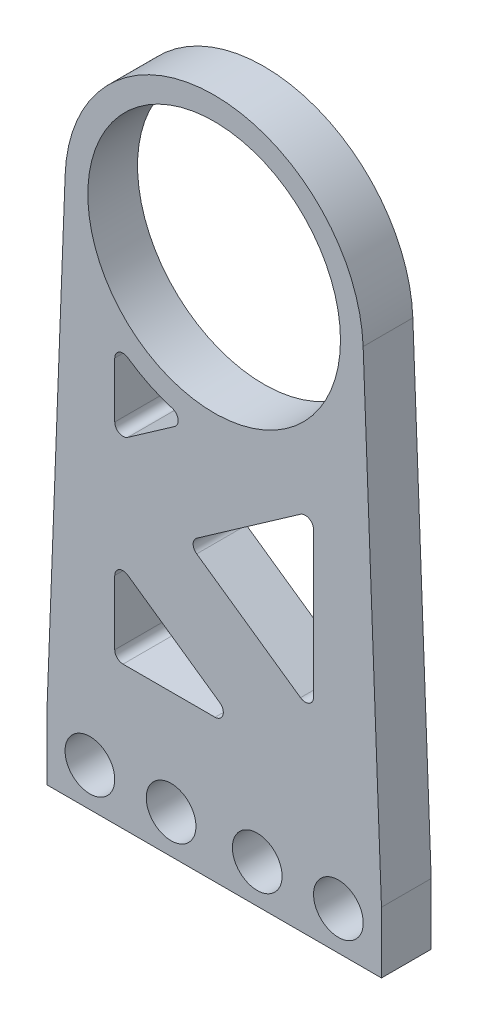
ISO-10303-21;
HEADER;
FILE_DESCRIPTION(('STEP AP214'),'2;1');
FILE_NAME('part.step','',(''),(''),'','','');
FILE_SCHEMA(('AUTOMOTIVE_DESIGN { 1 0 10303 214 1 1 1 1 }'));
ENDSEC;
DATA;
#1=APPLICATION_CONTEXT('core data for automotive mechanical design processes');
#2=APPLICATION_PROTOCOL_DEFINITION('international standard','automotive_design',2000,#1);
#3=PRODUCT_CONTEXT('',#1,'mechanical');
#4=PRODUCT('Part','Part','',(#3));
#5=PRODUCT_RELATED_PRODUCT_CATEGORY('part','',(#4));
#6=PRODUCT_DEFINITION_FORMATION('','',#4);
#7=PRODUCT_DEFINITION_CONTEXT('part definition',#1,'design');
#8=PRODUCT_DEFINITION('design','',#6,#7);
#9=PRODUCT_DEFINITION_SHAPE('','',#8);
#10=(LENGTH_UNIT() NAMED_UNIT(*) SI_UNIT(.MILLI.,.METRE.));
#11=(NAMED_UNIT(*) PLANE_ANGLE_UNIT() SI_UNIT($,.RADIAN.));
#12=(NAMED_UNIT(*) SI_UNIT($,.STERADIAN.) SOLID_ANGLE_UNIT());
#13=UNCERTAINTY_MEASURE_WITH_UNIT(LENGTH_MEASURE(1.E-05),#10,'distance_accuracy_value','');
#14=(GEOMETRIC_REPRESENTATION_CONTEXT(3) GLOBAL_UNCERTAINTY_ASSIGNED_CONTEXT((#13)) GLOBAL_UNIT_ASSIGNED_CONTEXT((#10,
#11,#12)) REPRESENTATION_CONTEXT('',''));
#15=CARTESIAN_POINT('',(0.,0.,0.));
#16=DIRECTION('',(0.,0.,1.));
#17=DIRECTION('',(1.,0.,0.));
#18=AXIS2_PLACEMENT_3D('',#15,#16,#17);
#19=CARTESIAN_POINT('',(0.,147.690874164974,6.));
#20=DIRECTION('',(0.,0.,1.));
#21=DIRECTION('',(1.,0.,0.));
#22=AXIS2_PLACEMENT_3D('',#19,#20,#21);
#23=PLANE('',#22);
#24=CARTESIAN_POINT('',(0.,147.690874164974,6.));
#25=DIRECTION('',(0.,0.,1.));
#26=DIRECTION('',(1.,0.,0.));
#27=AXIS2_PLACEMENT_3D('',#24,#25,#26);
#28=CIRCLE('',#27,15.25);
#29=CARTESIAN_POINT('',(15.25,147.690874164974,6.));
#30=VERTEX_POINT('',#29);
#31=EDGE_CURVE('E697',#30,#30,#28,.T.);
#32=ORIENTED_EDGE('',*,*,#31,.F.);
#33=EDGE_LOOP('',(#32));
#34=FACE_BOUND('',#33,.T.);
#35=DIRECTION('',(-0.819363481780087,0.573274353800354,0.));
#36=VECTOR('',#35,1.);
#37=CARTESIAN_POINT('',(3.27817254190081,100.690874164974,6.));
#38=LINE('',#37,#36);
#39=CARTESIAN_POINT('',(0.677812021370654,102.510237646754,6.));
#40=VERTEX_POINT('',#39);
#41=CARTESIAN_POINT('',(-10.4267256461996,110.279618144159,6.));
#42=VERTEX_POINT('',#41);
#43=EDGE_CURVE('E710',#40,#42,#38,.T.);
#44=ORIENTED_EDGE('',*,*,#43,.F.);
#45=CARTESIAN_POINT('',(0.104537667570299,101.690874164974,6.));
#46=DIRECTION('',(0.,0.,1.));
#47=DIRECTION('',(1.,0.,0.));
#48=AXIS2_PLACEMENT_3D('',#45,#46,#47);
#49=CIRCLE('',#48,1.);
#50=CARTESIAN_POINT('',(0.104537667570299,100.690874164974,6.));
#51=VERTEX_POINT('',#50);
#52=EDGE_CURVE('E336',#40,#51,#49,.F.);
#53=ORIENTED_EDGE('',*,*,#52,.T.);
#54=DIRECTION('',(1.,0.,0.));
#55=VECTOR('',#54,1.);
#56=CARTESIAN_POINT('',(-12.,100.690874164974,6.));
#57=LINE('',#56,#55);
#58=CARTESIAN_POINT('',(-11.,100.690874164974,6.));
#59=VERTEX_POINT('',#58);
#60=EDGE_CURVE('E704',#59,#51,#57,.T.);
#61=ORIENTED_EDGE('',*,*,#60,.F.);
#62=CARTESIAN_POINT('',(-11.,101.690874164974,6.));
#63=DIRECTION('',(0.,0.,1.));
#64=DIRECTION('',(1.,0.,0.));
#65=AXIS2_PLACEMENT_3D('',#62,#63,#64);
#66=CIRCLE('',#65,1.);
#67=CARTESIAN_POINT('',(-12.,101.690874164974,6.));
#68=VERTEX_POINT('',#67);
#69=EDGE_CURVE('E332',#59,#68,#66,.F.);
#70=ORIENTED_EDGE('',*,*,#69,.T.);
#71=DIRECTION('',(0.,-1.,0.));
#72=VECTOR('',#71,1.);
#73=CARTESIAN_POINT('',(-12.,111.380372398628,6.));
#74=LINE('',#73,#72);
#75=CARTESIAN_POINT('',(-12.,109.460254662379,6.));
#76=VERTEX_POINT('',#75);
#77=EDGE_CURVE('E707',#76,#68,#74,.T.);
#78=ORIENTED_EDGE('',*,*,#77,.F.);
#79=CARTESIAN_POINT('',(-11.,109.460254662379,6.));
#80=DIRECTION('',(0.,0.,1.));
#81=DIRECTION('',(1.,0.,0.));
#82=AXIS2_PLACEMENT_3D('',#79,#80,#81);
#83=CIRCLE('',#82,1.);
#84=EDGE_CURVE('E340',#76,#42,#83,.F.);
#85=ORIENTED_EDGE('',*,*,#84,.T.);
#86=EDGE_LOOP('',(#44,#53,#61,#70,#78,#85));
#87=FACE_BOUND('',#86,.T.);
#88=DIRECTION('',(0.819363481780087,-0.573274353800354,0.));
#89=VECTOR('',#88,1.);
#90=CARTESIAN_POINT('',(54.1066181017226,77.3329326548107,6.));
#91=LINE('',#90,#89);
#92=CARTESIAN_POINT('',(-2.10708140408131,116.663306750695,6.));
#93=VERTEX_POINT('',#92);
#94=CARTESIAN_POINT('',(10.4267256461996,107.89392625329,6.));
#95=VERTEX_POINT('',#94);
#96=EDGE_CURVE('E407',#93,#95,#91,.T.);
#97=ORIENTED_EDGE('',*,*,#96,.F.);
#98=CARTESIAN_POINT('',(-1.53380705028093,117.482670232475,6.));
#99=DIRECTION('',(0.,0.,1.));
#100=DIRECTION('',(1.,0.,0.));
#101=AXIS2_PLACEMENT_3D('',#98,#99,#100);
#102=CIRCLE('',#101,1.);
#103=CARTESIAN_POINT('',(-2.10708140408127,118.302033714255,6.));
#104=VERTEX_POINT('',#103);
#105=EDGE_CURVE('E352',#93,#104,#102,.F.);
#106=ORIENTED_EDGE('',*,*,#105,.T.);
#107=DIRECTION('',(0.819363481780087,0.573274353800354,0.));
#108=VECTOR('',#107,1.);
#109=CARTESIAN_POINT('',(-56.2613181971242,80.4125795300919,6.));
#110=LINE('',#109,#108);
#111=CARTESIAN_POINT('',(10.4267256461997,127.07141421166,6.));
#112=VERTEX_POINT('',#111);
#113=EDGE_CURVE('E404',#104,#112,#110,.T.);
#114=ORIENTED_EDGE('',*,*,#113,.T.);
#115=CARTESIAN_POINT('',(11.,126.25205072988,6.));
#116=DIRECTION('',(0.,0.,1.));
#117=DIRECTION('',(1.,0.,0.));
#118=AXIS2_PLACEMENT_3D('',#115,#116,#117);
#119=CIRCLE('',#118,1.);
#120=CARTESIAN_POINT('',(12.,126.25205072988,6.));
#121=VERTEX_POINT('',#120);
#122=EDGE_CURVE('E348',#112,#121,#119,.F.);
#123=ORIENTED_EDGE('',*,*,#122,.T.);
#124=DIRECTION('',(0.,-1.,0.));
#125=VECTOR('',#124,1.);
#126=CARTESIAN_POINT('',(12.,0.,6.));
#127=LINE('',#126,#125);
#128=CARTESIAN_POINT('',(12.,108.71328973507,6.));
#129=VERTEX_POINT('',#128);
#130=EDGE_CURVE('E410',#121,#129,#127,.T.);
#131=ORIENTED_EDGE('',*,*,#130,.T.);
#132=CARTESIAN_POINT('',(11.,108.71328973507,6.));
#133=DIRECTION('',(0.,0.,1.));
#134=DIRECTION('',(1.,0.,0.));
#135=AXIS2_PLACEMENT_3D('',#132,#133,#134);
#136=CIRCLE('',#135,1.);
#137=EDGE_CURVE('E344',#129,#95,#136,.F.);
#138=ORIENTED_EDGE('',*,*,#137,.T.);
#139=EDGE_LOOP('',(#97,#106,#114,#123,#131,#138));
#140=FACE_BOUND('',#139,.T.);
#141=CARTESIAN_POINT('',(15.,88.1240523814777,6.));
#142=DIRECTION('',(0.,0.,1.));
#143=DIRECTION('',(1.,0.,0.));
#144=AXIS2_PLACEMENT_3D('',#141,#142,#143);
#145=CIRCLE('',#144,3.);
#146=CARTESIAN_POINT('',(18.,88.1240523814777,6.));
#147=VERTEX_POINT('',#146);
#148=EDGE_CURVE('E417',#147,#147,#145,.T.);
#149=ORIENTED_EDGE('',*,*,#148,.F.);
#150=EDGE_LOOP('',(#149));
#151=FACE_BOUND('',#150,.T.);
#152=CARTESIAN_POINT('',(-5.20000000000001,88.1240523814777,6.));
#153=DIRECTION('',(0.,0.,1.));
#154=DIRECTION('',(1.,0.,0.));
#155=AXIS2_PLACEMENT_3D('',#152,#153,#154);
#156=CIRCLE('',#155,3.);
#157=CARTESIAN_POINT('',(-2.20000000000001,88.1240523814777,6.));
#158=VERTEX_POINT('',#157);
#159=EDGE_CURVE('E429',#158,#158,#156,.T.);
#160=ORIENTED_EDGE('',*,*,#159,.F.);
#161=EDGE_LOOP('',(#160));
#162=FACE_BOUND('',#161,.T.);
#163=DIRECTION('',(1.,0.,0.));
#164=VECTOR('',#163,1.);
#165=CARTESIAN_POINT('',(-9.10000000000001,83.4740523814777,6.));
#166=LINE('',#165,#164);
#167=CARTESIAN_POINT('',(-20.2,83.4740523814777,6.));
#168=VERTEX_POINT('',#167);
#169=CARTESIAN_POINT('',(20.2,83.4740523814778,6.));
#170=VERTEX_POINT('',#169);
#171=EDGE_CURVE('E230',#168,#170,#166,.T.);
#172=ORIENTED_EDGE('',*,*,#171,.T.);
#173=DIRECTION('',(0.,1.,0.));
#174=VECTOR('',#173,1.);
#175=CARTESIAN_POINT('',(20.2,83.4740523814778,6.));
#176=LINE('',#175,#174);
#177=CARTESIAN_POINT('',(20.2,90.8740523814777,6.));
#178=VERTEX_POINT('',#177);
#179=EDGE_CURVE('E234',#170,#178,#176,.T.);
#180=ORIENTED_EDGE('',*,*,#179,.T.);
#181=DIRECTION('',(-0.0384579142435939,0.999260220779369,0.));
#182=VECTOR('',#181,1.);
#183=CARTESIAN_POINT('',(20.2,90.8740523814777,6.));
#184=LINE('',#183,#182);
#185=CARTESIAN_POINT('',(17.9866839740286,148.383116621359,6.));
#186=VERTEX_POINT('',#185);
#187=EDGE_CURVE('E254',#178,#186,#184,.T.);
#188=ORIENTED_EDGE('',*,*,#187,.T.);
#189=CARTESIAN_POINT('',(0.,147.690874164974,6.));
#190=DIRECTION('',(0.,0.,1.));
#191=DIRECTION('',(1.,0.,0.));
#192=AXIS2_PLACEMENT_3D('',#189,#190,#191);
#193=CIRCLE('',#192,18.);
#194=CARTESIAN_POINT('',(-17.9866839740286,148.383116621359,6.));
#195=VERTEX_POINT('',#194);
#196=EDGE_CURVE('E256',#186,#195,#193,.T.);
#197=ORIENTED_EDGE('',*,*,#196,.T.);
#198=DIRECTION('',(-0.0384579142435939,-0.999260220779369,0.));
#199=VECTOR('',#198,1.);
#200=CARTESIAN_POINT('',(-20.2,90.8740523814777,6.));
#201=LINE('',#200,#199);
#202=CARTESIAN_POINT('',(-20.2,90.8740523814777,6.));
#203=VERTEX_POINT('',#202);
#204=EDGE_CURVE('E261',#195,#203,#201,.T.);
#205=ORIENTED_EDGE('',*,*,#204,.T.);
#206=DIRECTION('',(0.,-1.,0.));
#207=VECTOR('',#206,1.);
#208=CARTESIAN_POINT('',(-20.2,83.4740523814777,6.));
#209=LINE('',#208,#207);
#210=EDGE_CURVE('E237',#203,#168,#209,.T.);
#211=ORIENTED_EDGE('',*,*,#210,.T.);
#212=EDGE_LOOP('',(#172,#180,#188,#197,#205,#211));
#213=FACE_BOUND('',#212,.T.);
#214=CARTESIAN_POINT('',(-15.,88.1240523814777,6.));
#215=DIRECTION('',(0.,0.,1.));
#216=DIRECTION('',(1.,0.,0.));
#217=AXIS2_PLACEMENT_3D('',#214,#215,#216);
#218=CIRCLE('',#217,3.);
#219=CARTESIAN_POINT('',(-12.,88.1240523814777,6.));
#220=VERTEX_POINT('',#219);
#221=EDGE_CURVE('E268',#220,#220,#218,.T.);
#222=ORIENTED_EDGE('',*,*,#221,.F.);
#223=EDGE_LOOP('',(#222));
#224=FACE_BOUND('',#223,.T.);
#225=CARTESIAN_POINT('',(5.20000000000001,88.1240523814777,6.));
#226=DIRECTION('',(0.,0.,1.));
#227=DIRECTION('',(1.,0.,0.));
#228=AXIS2_PLACEMENT_3D('',#225,#226,#227);
#229=CIRCLE('',#228,3.);
#230=CARTESIAN_POINT('',(8.20000000000001,88.1240523814777,6.));
#231=VERTEX_POINT('',#230);
#232=EDGE_CURVE('E423',#231,#231,#229,.T.);
#233=ORIENTED_EDGE('',*,*,#232,.F.);
#234=EDGE_LOOP('',(#233));
#235=FACE_BOUND('',#234,.T.);
#236=DIRECTION('',(0.,-1.,0.));
#237=VECTOR('',#236,1.);
#238=CARTESIAN_POINT('',(-11.9999999999999,0.,6.));
#239=LINE('',#238,#237);
#240=CARTESIAN_POINT('',(-12.,132.198940780145,6.));
#241=VERTEX_POINT('',#240);
#242=CARTESIAN_POINT('',(-12.,125.505085802571,6.));
#243=VERTEX_POINT('',#242);
#244=EDGE_CURVE('E367',#241,#243,#239,.T.);
#245=ORIENTED_EDGE('',*,*,#244,.F.);
#246=CARTESIAN_POINT('',(-11.,132.198940780145,6.));
#247=DIRECTION('',(0.,0.,1.));
#248=DIRECTION('',(1.,0.,0.));
#249=AXIS2_PLACEMENT_3D('',#246,#247,#248);
#250=CIRCLE('',#249,1.);
#251=CARTESIAN_POINT('',(-10.4210526315789,133.014305695136,6.));
#252=VERTEX_POINT('',#251);
#253=EDGE_CURVE('E77',#241,#252,#250,.F.);
#254=ORIENTED_EDGE('',*,*,#253,.T.);
#255=CARTESIAN_POINT('',(0.,147.690874164974,6.));
#256=DIRECTION('',(0.,0.,1.));
#257=DIRECTION('',(1.,0.,0.));
#258=AXIS2_PLACEMENT_3D('',#255,#256,#257);
#259=CIRCLE('',#258,18.);
#260=CARTESIAN_POINT('',(-5.06699342831076,130.418770135718,6.));
#261=VERTEX_POINT('',#260);
#262=EDGE_CURVE('E365',#252,#261,#259,.T.);
#263=ORIENTED_EDGE('',*,*,#262,.T.);
#264=CARTESIAN_POINT('',(-5.34849306321691,129.459208800759,6.));
#265=DIRECTION('',(0.,0.,1.));
#266=DIRECTION('',(1.,0.,0.));
#267=AXIS2_PLACEMENT_3D('',#264,#265,#266);
#268=CIRCLE('',#267,1.);
#269=CARTESIAN_POINT('',(-4.77521870941656,128.639845318979,6.));
#270=VERTEX_POINT('',#269);
#271=EDGE_CURVE('E360',#261,#270,#268,.F.);
#272=ORIENTED_EDGE('',*,*,#271,.T.);
#273=DIRECTION('',(0.819363481780086,0.573274353800355,0.));
#274=VECTOR('',#273,1.);
#275=CARTESIAN_POINT('',(-61.9940617351278,88.6062143478926,6.));
#276=LINE('',#275,#274);
#277=CARTESIAN_POINT('',(-10.4267256461997,124.685722320791,6.));
#278=VERTEX_POINT('',#277);
#279=EDGE_CURVE('E383',#278,#270,#276,.T.);
#280=ORIENTED_EDGE('',*,*,#279,.F.);
#281=CARTESIAN_POINT('',(-11.,125.505085802571,6.));
#282=DIRECTION('',(0.,0.,1.));
#283=DIRECTION('',(1.,0.,0.));
#284=AXIS2_PLACEMENT_3D('',#281,#282,#283);
#285=CIRCLE('',#284,1.);
#286=EDGE_CURVE('E356',#278,#243,#285,.F.);
#287=ORIENTED_EDGE('',*,*,#286,.T.);
#288=EDGE_LOOP('',(#245,#254,#263,#272,#280,#287));
#289=FACE_BOUND('',#288,.T.);
#290=ADVANCED_FACE('F69',(#34,#87,#140,#151,#162,#213,#224,#235,#289),#23,.T.);
#291=CARTESIAN_POINT('',(0.,147.690874164974,0.));
#292=DIRECTION('',(0.,0.,1.));
#293=DIRECTION('',(1.,0.,0.));
#294=AXIS2_PLACEMENT_3D('',#291,#292,#293);
#295=PLANE('',#294);
#296=CARTESIAN_POINT('',(0.,147.690874164974,0.));
#297=DIRECTION('',(0.,0.,1.));
#298=DIRECTION('',(1.,0.,0.));
#299=AXIS2_PLACEMENT_3D('',#296,#297,#298);
#300=CIRCLE('',#299,15.25);
#301=CARTESIAN_POINT('',(15.25,147.690874164974,0.));
#302=VERTEX_POINT('',#301);
#303=EDGE_CURVE('E695',#302,#302,#300,.T.);
#304=ORIENTED_EDGE('',*,*,#303,.T.);
#305=EDGE_LOOP('',(#304));
#306=FACE_BOUND('',#305,.T.);
#307=DIRECTION('',(-1.,0.,0.));
#308=VECTOR('',#307,1.);
#309=CARTESIAN_POINT('',(-12.,100.690874164974,0.));
#310=LINE('',#309,#308);
#311=CARTESIAN_POINT('',(0.104537667570299,100.690874164974,0.));
#312=VERTEX_POINT('',#311);
#313=CARTESIAN_POINT('',(-11.,100.690874164974,0.));
#314=VERTEX_POINT('',#313);
#315=EDGE_CURVE('E384',#312,#314,#310,.T.);
#316=ORIENTED_EDGE('',*,*,#315,.F.);
#317=CARTESIAN_POINT('',(0.104537667570299,101.690874164974,0.));
#318=DIRECTION('',(0.,0.,1.));
#319=DIRECTION('',(1.,0.,0.));
#320=AXIS2_PLACEMENT_3D('',#317,#318,#319);
#321=CIRCLE('',#320,1.);
#322=CARTESIAN_POINT('',(0.677812021370653,102.510237646754,0.));
#323=VERTEX_POINT('',#322);
#324=EDGE_CURVE('E338',#312,#323,#321,.T.);
#325=ORIENTED_EDGE('',*,*,#324,.T.);
#326=DIRECTION('',(0.819363481780087,-0.573274353800354,0.));
#327=VECTOR('',#326,1.);
#328=CARTESIAN_POINT('',(3.27817254190081,100.690874164974,0.));
#329=LINE('',#328,#327);
#330=CARTESIAN_POINT('',(-10.4267256461996,110.279618144159,0.));
#331=VERTEX_POINT('',#330);
#332=EDGE_CURVE('E389',#331,#323,#329,.T.);
#333=ORIENTED_EDGE('',*,*,#332,.F.);
#334=CARTESIAN_POINT('',(-11.,109.460254662379,0.));
#335=DIRECTION('',(0.,0.,1.));
#336=DIRECTION('',(1.,0.,0.));
#337=AXIS2_PLACEMENT_3D('',#334,#335,#336);
#338=CIRCLE('',#337,1.);
#339=CARTESIAN_POINT('',(-12.,109.460254662379,0.));
#340=VERTEX_POINT('',#339);
#341=EDGE_CURVE('E342',#331,#340,#338,.T.);
#342=ORIENTED_EDGE('',*,*,#341,.T.);
#343=DIRECTION('',(0.,1.,0.));
#344=VECTOR('',#343,1.);
#345=CARTESIAN_POINT('',(-12.,111.380372398628,0.));
#346=LINE('',#345,#344);
#347=CARTESIAN_POINT('',(-12.,101.690874164974,0.));
#348=VERTEX_POINT('',#347);
#349=EDGE_CURVE('E699',#348,#340,#346,.T.);
#350=ORIENTED_EDGE('',*,*,#349,.F.);
#351=CARTESIAN_POINT('',(-11.,101.690874164974,0.));
#352=DIRECTION('',(0.,0.,1.));
#353=DIRECTION('',(1.,0.,0.));
#354=AXIS2_PLACEMENT_3D('',#351,#352,#353);
#355=CIRCLE('',#354,1.);
#356=EDGE_CURVE('E334',#348,#314,#355,.T.);
#357=ORIENTED_EDGE('',*,*,#356,.T.);
#358=EDGE_LOOP('',(#316,#325,#333,#342,#350,#357));
#359=FACE_BOUND('',#358,.T.);
#360=DIRECTION('',(0.,1.,0.));
#361=VECTOR('',#360,1.);
#362=CARTESIAN_POINT('',(12.,0.,0.));
#363=LINE('',#362,#361);
#364=CARTESIAN_POINT('',(12.,108.71328973507,0.));
#365=VERTEX_POINT('',#364);
#366=CARTESIAN_POINT('',(12.,126.25205072988,0.));
#367=VERTEX_POINT('',#366);
#368=EDGE_CURVE('E398',#365,#367,#363,.T.);
#369=ORIENTED_EDGE('',*,*,#368,.T.);
#370=CARTESIAN_POINT('',(11.,126.25205072988,0.));
#371=DIRECTION('',(0.,0.,1.));
#372=DIRECTION('',(1.,0.,0.));
#373=AXIS2_PLACEMENT_3D('',#370,#371,#372);
#374=CIRCLE('',#373,1.);
#375=CARTESIAN_POINT('',(10.4267256461997,127.07141421166,0.));
#376=VERTEX_POINT('',#375);
#377=EDGE_CURVE('E350',#367,#376,#374,.T.);
#378=ORIENTED_EDGE('',*,*,#377,.T.);
#379=DIRECTION('',(-0.819363481780087,-0.573274353800354,0.));
#380=VECTOR('',#379,1.);
#381=CARTESIAN_POINT('',(-56.2613181971242,80.4125795300919,0.));
#382=LINE('',#381,#380);
#383=CARTESIAN_POINT('',(-2.10708140408129,118.302033714255,0.));
#384=VERTEX_POINT('',#383);
#385=EDGE_CURVE('E401',#376,#384,#382,.T.);
#386=ORIENTED_EDGE('',*,*,#385,.T.);
#387=CARTESIAN_POINT('',(-1.53380705028093,117.482670232475,0.));
#388=DIRECTION('',(0.,0.,1.));
#389=DIRECTION('',(1.,0.,0.));
#390=AXIS2_PLACEMENT_3D('',#387,#388,#389);
#391=CIRCLE('',#390,1.);
#392=CARTESIAN_POINT('',(-2.10708140408129,116.663306750695,0.));
#393=VERTEX_POINT('',#392);
#394=EDGE_CURVE('E354',#384,#393,#391,.T.);
#395=ORIENTED_EDGE('',*,*,#394,.T.);
#396=DIRECTION('',(-0.819363481780087,0.573274353800354,0.));
#397=VECTOR('',#396,1.);
#398=CARTESIAN_POINT('',(54.1066181017226,77.3329326548107,0.));
#399=LINE('',#398,#397);
#400=CARTESIAN_POINT('',(10.4267256461996,107.89392625329,0.));
#401=VERTEX_POINT('',#400);
#402=EDGE_CURVE('E413',#401,#393,#399,.T.);
#403=ORIENTED_EDGE('',*,*,#402,.F.);
#404=CARTESIAN_POINT('',(11.,108.71328973507,0.));
#405=DIRECTION('',(0.,0.,1.));
#406=DIRECTION('',(1.,0.,0.));
#407=AXIS2_PLACEMENT_3D('',#404,#405,#406);
#408=CIRCLE('',#407,1.);
#409=EDGE_CURVE('E346',#401,#365,#408,.T.);
#410=ORIENTED_EDGE('',*,*,#409,.T.);
#411=EDGE_LOOP('',(#369,#378,#386,#395,#403,#410));
#412=FACE_BOUND('',#411,.T.);
#413=CARTESIAN_POINT('',(15.,88.1240523814777,0.));
#414=DIRECTION('',(0.,0.,1.));
#415=DIRECTION('',(1.,0.,0.));
#416=AXIS2_PLACEMENT_3D('',#413,#414,#415);
#417=CIRCLE('',#416,3.);
#418=CARTESIAN_POINT('',(18.,88.1240523814777,0.));
#419=VERTEX_POINT('',#418);
#420=EDGE_CURVE('E416',#419,#419,#417,.T.);
#421=ORIENTED_EDGE('',*,*,#420,.T.);
#422=EDGE_LOOP('',(#421));
#423=FACE_BOUND('',#422,.T.);
#424=CARTESIAN_POINT('',(-5.20000000000001,88.1240523814777,0.));
#425=DIRECTION('',(0.,0.,1.));
#426=DIRECTION('',(1.,0.,0.));
#427=AXIS2_PLACEMENT_3D('',#424,#425,#426);
#428=CIRCLE('',#427,3.);
#429=CARTESIAN_POINT('',(-2.20000000000001,88.1240523814777,0.));
#430=VERTEX_POINT('',#429);
#431=EDGE_CURVE('E426',#430,#430,#428,.T.);
#432=ORIENTED_EDGE('',*,*,#431,.T.);
#433=EDGE_LOOP('',(#432));
#434=FACE_BOUND('',#433,.T.);
#435=DIRECTION('',(0.,1.,0.));
#436=VECTOR('',#435,1.);
#437=CARTESIAN_POINT('',(20.2,83.4740523814778,0.));
#438=LINE('',#437,#436);
#439=CARTESIAN_POINT('',(20.2,83.4740523814778,0.));
#440=VERTEX_POINT('',#439);
#441=CARTESIAN_POINT('',(20.2,90.8740523814777,0.));
#442=VERTEX_POINT('',#441);
#443=EDGE_CURVE('E265',#440,#442,#438,.T.);
#444=ORIENTED_EDGE('',*,*,#443,.F.);
#445=DIRECTION('',(1.,0.,0.));
#446=VECTOR('',#445,1.);
#447=CARTESIAN_POINT('',(-11.1,83.4740523814777,0.));
#448=LINE('',#447,#446);
#449=CARTESIAN_POINT('',(-20.2,83.4740523814777,0.));
#450=VERTEX_POINT('',#449);
#451=EDGE_CURVE('E241',#450,#440,#448,.T.);
#452=ORIENTED_EDGE('',*,*,#451,.F.);
#453=DIRECTION('',(0.,-1.,0.));
#454=VECTOR('',#453,1.);
#455=CARTESIAN_POINT('',(-20.2,83.4740523814777,0.));
#456=LINE('',#455,#454);
#457=CARTESIAN_POINT('',(-20.2,90.8740523814777,0.));
#458=VERTEX_POINT('',#457);
#459=EDGE_CURVE('E274',#458,#450,#456,.T.);
#460=ORIENTED_EDGE('',*,*,#459,.F.);
#461=DIRECTION('',(-0.0384579142435939,-0.999260220779369,0.));
#462=VECTOR('',#461,1.);
#463=CARTESIAN_POINT('',(-20.2,90.8740523814777,0.));
#464=LINE('',#463,#462);
#465=CARTESIAN_POINT('',(-17.9866839740286,148.383116621359,0.));
#466=VERTEX_POINT('',#465);
#467=EDGE_CURVE('E272',#466,#458,#464,.T.);
#468=ORIENTED_EDGE('',*,*,#467,.F.);
#469=CARTESIAN_POINT('',(0.,147.690874164974,0.));
#470=DIRECTION('',(0.,0.,1.));
#471=DIRECTION('',(1.,0.,0.));
#472=AXIS2_PLACEMENT_3D('',#469,#470,#471);
#473=CIRCLE('',#472,18.);
#474=CARTESIAN_POINT('',(17.9866839740286,148.383116621359,0.));
#475=VERTEX_POINT('',#474);
#476=EDGE_CURVE('E270',#475,#466,#473,.T.);
#477=ORIENTED_EDGE('',*,*,#476,.F.);
#478=DIRECTION('',(-0.0384579142435939,0.999260220779369,0.));
#479=VECTOR('',#478,1.);
#480=CARTESIAN_POINT('',(20.2,90.8740523814777,0.));
#481=LINE('',#480,#479);
#482=EDGE_CURVE('E267',#442,#475,#481,.T.);
#483=ORIENTED_EDGE('',*,*,#482,.F.);
#484=EDGE_LOOP('',(#444,#452,#460,#468,#477,#483));
#485=FACE_BOUND('',#484,.T.);
#486=CARTESIAN_POINT('',(-15.,88.1240523814777,0.));
#487=DIRECTION('',(0.,0.,1.));
#488=DIRECTION('',(1.,0.,0.));
#489=AXIS2_PLACEMENT_3D('',#486,#487,#488);
#490=CIRCLE('',#489,3.);
#491=CARTESIAN_POINT('',(-12.,88.1240523814777,0.));
#492=VERTEX_POINT('',#491);
#493=EDGE_CURVE('E432',#492,#492,#490,.T.);
#494=ORIENTED_EDGE('',*,*,#493,.T.);
#495=EDGE_LOOP('',(#494));
#496=FACE_BOUND('',#495,.T.);
#497=CARTESIAN_POINT('',(5.20000000000001,88.1240523814777,0.));
#498=DIRECTION('',(0.,0.,1.));
#499=DIRECTION('',(1.,0.,0.));
#500=AXIS2_PLACEMENT_3D('',#497,#498,#499);
#501=CIRCLE('',#500,3.);
#502=CARTESIAN_POINT('',(8.20000000000001,88.1240523814777,0.));
#503=VERTEX_POINT('',#502);
#504=EDGE_CURVE('E420',#503,#503,#501,.T.);
#505=ORIENTED_EDGE('',*,*,#504,.T.);
#506=EDGE_LOOP('',(#505));
#507=FACE_BOUND('',#506,.T.);
#508=DIRECTION('',(-0.819363481780086,-0.573274353800355,0.));
#509=VECTOR('',#508,1.);
#510=CARTESIAN_POINT('',(-61.9940617351278,88.6062143478926,0.));
#511=LINE('',#510,#509);
#512=CARTESIAN_POINT('',(-4.77521870941656,128.639845318979,0.));
#513=VERTEX_POINT('',#512);
#514=CARTESIAN_POINT('',(-10.4267256461997,124.685722320791,0.));
#515=VERTEX_POINT('',#514);
#516=EDGE_CURVE('E395',#513,#515,#511,.T.);
#517=ORIENTED_EDGE('',*,*,#516,.F.);
#518=CARTESIAN_POINT('',(-5.34849306321691,129.459208800759,0.));
#519=DIRECTION('',(0.,0.,1.));
#520=DIRECTION('',(1.,0.,0.));
#521=AXIS2_PLACEMENT_3D('',#518,#519,#520);
#522=CIRCLE('',#521,1.);
#523=CARTESIAN_POINT('',(-5.06699342831076,130.418770135718,0.));
#524=VERTEX_POINT('',#523);
#525=EDGE_CURVE('E91',#513,#524,#522,.T.);
#526=ORIENTED_EDGE('',*,*,#525,.T.);
#527=CARTESIAN_POINT('',(0.,147.690874164974,0.));
#528=DIRECTION('',(0.,0.,1.));
#529=DIRECTION('',(1.,0.,0.));
#530=AXIS2_PLACEMENT_3D('',#527,#528,#529);
#531=CIRCLE('',#530,18.);
#532=CARTESIAN_POINT('',(-10.4210526315789,133.014305695136,0.));
#533=VERTEX_POINT('',#532);
#534=EDGE_CURVE('E372',#524,#533,#531,.F.);
#535=ORIENTED_EDGE('',*,*,#534,.T.);
#536=CARTESIAN_POINT('',(-11.,132.198940780145,0.));
#537=DIRECTION('',(0.,0.,1.));
#538=DIRECTION('',(1.,0.,0.));
#539=AXIS2_PLACEMENT_3D('',#536,#537,#538);
#540=CIRCLE('',#539,1.);
#541=CARTESIAN_POINT('',(-12.,132.198940780145,0.));
#542=VERTEX_POINT('',#541);
#543=EDGE_CURVE('E12',#533,#542,#540,.T.);
#544=ORIENTED_EDGE('',*,*,#543,.T.);
#545=DIRECTION('',(0.,1.,0.));
#546=VECTOR('',#545,1.);
#547=CARTESIAN_POINT('',(-11.9999999999999,0.,0.));
#548=LINE('',#547,#546);
#549=CARTESIAN_POINT('',(-12.,125.505085802571,0.));
#550=VERTEX_POINT('',#549);
#551=EDGE_CURVE('E378',#550,#542,#548,.T.);
#552=ORIENTED_EDGE('',*,*,#551,.F.);
#553=CARTESIAN_POINT('',(-11.,125.505085802571,0.));
#554=DIRECTION('',(0.,0.,1.));
#555=DIRECTION('',(1.,0.,0.));
#556=AXIS2_PLACEMENT_3D('',#553,#554,#555);
#557=CIRCLE('',#556,1.);
#558=EDGE_CURVE('E358',#550,#515,#557,.T.);
#559=ORIENTED_EDGE('',*,*,#558,.T.);
#560=EDGE_LOOP('',(#517,#526,#535,#544,#552,#559));
#561=FACE_BOUND('',#560,.T.);
#562=ADVANCED_FACE('F377',(#306,#359,#412,#423,#434,#485,#496,#507,#561),#295,.F.);
#563=CARTESIAN_POINT('',(20.2,83.4740523814778,6.));
#564=DIRECTION('',(-1.,0.,0.));
#565=DIRECTION('',(0.,0.,1.));
#566=AXIS2_PLACEMENT_3D('',#563,#564,#565);
#567=PLANE('',#566);
#568=ORIENTED_EDGE('',*,*,#443,.T.);
#569=DIRECTION('',(0.,0.,-1.));
#570=VECTOR('',#569,1.);
#571=CARTESIAN_POINT('',(20.2,90.8740523814777,6.));
#572=LINE('',#571,#570);
#573=EDGE_CURVE('E249',#178,#442,#572,.T.);
#574=ORIENTED_EDGE('',*,*,#573,.F.);
#575=ORIENTED_EDGE('',*,*,#179,.F.);
#576=DIRECTION('',(0.,0.,-1.));
#577=VECTOR('',#576,1.);
#578=CARTESIAN_POINT('',(20.2,83.4740523814778,6.));
#579=LINE('',#578,#577);
#580=EDGE_CURVE('E244',#170,#440,#579,.T.);
#581=ORIENTED_EDGE('',*,*,#580,.T.);
#582=EDGE_LOOP('',(#568,#574,#575,#581));
#583=FACE_BOUND('',#582,.T.);
#584=ADVANCED_FACE('F251',(#583),#567,.F.);
#585=CARTESIAN_POINT('',(20.2,90.8740523814777,6.));
#586=DIRECTION('',(-0.999260220779368,-0.0384579142435939,0.));
#587=DIRECTION('',(0.0384579142435939,-0.999260220779369,0.));
#588=AXIS2_PLACEMENT_3D('',#585,#586,#587);
#589=PLANE('',#588);
#590=ORIENTED_EDGE('',*,*,#482,.T.);
#591=DIRECTION('',(0.,0.,-1.));
#592=VECTOR('',#591,1.);
#593=CARTESIAN_POINT('',(17.9866839740286,148.383116621359,6.));
#594=LINE('',#593,#592);
#595=EDGE_CURVE('E285',#186,#475,#594,.T.);
#596=ORIENTED_EDGE('',*,*,#595,.F.);
#597=ORIENTED_EDGE('',*,*,#187,.F.);
#598=ORIENTED_EDGE('',*,*,#573,.T.);
#599=EDGE_LOOP('',(#590,#596,#597,#598));
#600=FACE_BOUND('',#599,.T.);
#601=ADVANCED_FACE('F476',(#600),#589,.F.);
#602=CARTESIAN_POINT('',(0.,147.690874164974,6.));
#603=DIRECTION('',(0.,0.,-1.));
#604=DIRECTION('',(-1.,0.,0.));
#605=AXIS2_PLACEMENT_3D('',#602,#603,#604);
#606=CYLINDRICAL_SURFACE('',#605,18.);
#607=ORIENTED_EDGE('',*,*,#476,.T.);
#608=DIRECTION('',(0.,0.,-1.));
#609=VECTOR('',#608,1.);
#610=CARTESIAN_POINT('',(-17.9866839740286,148.383116621359,6.));
#611=LINE('',#610,#609);
#612=EDGE_CURVE('E282',#195,#466,#611,.T.);
#613=ORIENTED_EDGE('',*,*,#612,.F.);
#614=ORIENTED_EDGE('',*,*,#196,.F.);
#615=ORIENTED_EDGE('',*,*,#595,.T.);
#616=EDGE_LOOP('',(#607,#613,#614,#615));
#617=FACE_BOUND('',#616,.T.);
#618=ADVANCED_FACE('F472',(#617),#606,.T.);
#619=CARTESIAN_POINT('',(-20.2,90.8740523814777,6.));
#620=DIRECTION('',(0.999260220779368,-0.0384579142435939,0.));
#621=DIRECTION('',(0.0384579142435939,0.999260220779369,0.));
#622=AXIS2_PLACEMENT_3D('',#619,#620,#621);
#623=PLANE('',#622);
#624=ORIENTED_EDGE('',*,*,#467,.T.);
#625=DIRECTION('',(0.,0.,-1.));
#626=VECTOR('',#625,1.);
#627=CARTESIAN_POINT('',(-20.2,90.8740523814777,6.));
#628=LINE('',#627,#626);
#629=EDGE_CURVE('E279',#203,#458,#628,.T.);
#630=ORIENTED_EDGE('',*,*,#629,.F.);
#631=ORIENTED_EDGE('',*,*,#204,.F.);
#632=ORIENTED_EDGE('',*,*,#612,.T.);
#633=EDGE_LOOP('',(#624,#630,#631,#632));
#634=FACE_BOUND('',#633,.T.);
#635=ADVANCED_FACE('F468',(#634),#623,.F.);
#636=CARTESIAN_POINT('',(-20.2,83.4740523814777,6.));
#637=DIRECTION('',(1.,0.,0.));
#638=DIRECTION('',(0.,0.,-1.));
#639=AXIS2_PLACEMENT_3D('',#636,#637,#638);
#640=PLANE('',#639);
#641=ORIENTED_EDGE('',*,*,#459,.T.);
#642=DIRECTION('',(0.,0.,-1.));
#643=VECTOR('',#642,1.);
#644=CARTESIAN_POINT('',(-20.2,83.4740523814777,6.));
#645=LINE('',#644,#643);
#646=EDGE_CURVE('E264',#168,#450,#645,.T.);
#647=ORIENTED_EDGE('',*,*,#646,.F.);
#648=ORIENTED_EDGE('',*,*,#210,.F.);
#649=ORIENTED_EDGE('',*,*,#629,.T.);
#650=EDGE_LOOP('',(#641,#647,#648,#649));
#651=FACE_BOUND('',#650,.T.);
#652=ADVANCED_FACE('F453',(#651),#640,.F.);
#653=CARTESIAN_POINT('',(-11.1,83.4740523814777,6.));
#654=DIRECTION('',(0.,1.,0.));
#655=DIRECTION('',(0.,0.,1.));
#656=AXIS2_PLACEMENT_3D('',#653,#654,#655);
#657=PLANE('',#656);
#658=ORIENTED_EDGE('',*,*,#451,.T.);
#659=ORIENTED_EDGE('',*,*,#580,.F.);
#660=ORIENTED_EDGE('',*,*,#171,.F.);
#661=ORIENTED_EDGE('',*,*,#646,.T.);
#662=EDGE_LOOP('',(#658,#659,#660,#661));
#663=FACE_BOUND('',#662,.T.);
#664=ADVANCED_FACE('F245',(#663),#657,.F.);
#665=CARTESIAN_POINT('',(-15.,88.1240523814777,6.));
#666=DIRECTION('',(0.,0.,-1.));
#667=DIRECTION('',(-1.,0.,0.));
#668=AXIS2_PLACEMENT_3D('',#665,#666,#667);
#669=CYLINDRICAL_SURFACE('',#668,3.);
#670=ORIENTED_EDGE('',*,*,#221,.T.);
#671=EDGE_LOOP('',(#670));
#672=FACE_BOUND('',#671,.T.);
#673=ORIENTED_EDGE('',*,*,#493,.F.);
#674=EDGE_LOOP('',(#673));
#675=FACE_BOUND('',#674,.T.);
#676=ADVANCED_FACE('F441',(#672,#675),#669,.F.);
#677=CARTESIAN_POINT('',(-5.20000000000001,88.1240523814777,6.));
#678=DIRECTION('',(0.,0.,-1.));
#679=DIRECTION('',(-1.,0.,0.));
#680=AXIS2_PLACEMENT_3D('',#677,#678,#679);
#681=CYLINDRICAL_SURFACE('',#680,3.);
#682=ORIENTED_EDGE('',*,*,#159,.T.);
#683=EDGE_LOOP('',(#682));
#684=FACE_BOUND('',#683,.T.);
#685=ORIENTED_EDGE('',*,*,#431,.F.);
#686=EDGE_LOOP('',(#685));
#687=FACE_BOUND('',#686,.T.);
#688=ADVANCED_FACE('F443',(#684,#687),#681,.F.);
#689=CARTESIAN_POINT('',(5.20000000000001,88.1240523814777,6.));
#690=DIRECTION('',(0.,0.,-1.));
#691=DIRECTION('',(-1.,0.,0.));
#692=AXIS2_PLACEMENT_3D('',#689,#690,#691);
#693=CYLINDRICAL_SURFACE('',#692,3.);
#694=ORIENTED_EDGE('',*,*,#232,.T.);
#695=EDGE_LOOP('',(#694));
#696=FACE_BOUND('',#695,.T.);
#697=ORIENTED_EDGE('',*,*,#504,.F.);
#698=EDGE_LOOP('',(#697));
#699=FACE_BOUND('',#698,.T.);
#700=ADVANCED_FACE('F450',(#696,#699),#693,.F.);
#701=CARTESIAN_POINT('',(15.,88.1240523814777,6.));
#702=DIRECTION('',(0.,0.,-1.));
#703=DIRECTION('',(-1.,0.,0.));
#704=AXIS2_PLACEMENT_3D('',#701,#702,#703);
#705=CYLINDRICAL_SURFACE('',#704,3.);
#706=ORIENTED_EDGE('',*,*,#148,.T.);
#707=EDGE_LOOP('',(#706));
#708=FACE_BOUND('',#707,.T.);
#709=ORIENTED_EDGE('',*,*,#420,.F.);
#710=EDGE_LOOP('',(#709));
#711=FACE_BOUND('',#710,.T.);
#712=ADVANCED_FACE('F544',(#708,#711),#705,.F.);
#713=CARTESIAN_POINT('',(-56.2613181971242,80.4125795300919,-0.00100000000000013));
#714=DIRECTION('',(0.573274353800354,-0.819363481780087,0.));
#715=DIRECTION('',(0.819363481780087,0.573274353800354,0.));
#716=AXIS2_PLACEMENT_3D('',#713,#714,#715);
#717=PLANE('',#716);
#718=ORIENTED_EDGE('',*,*,#385,.F.);
#719=DIRECTION('',(0.,0.,1.));
#720=VECTOR('',#719,1.);
#721=CARTESIAN_POINT('',(10.4267256461996,127.07141421166,6.));
#722=LINE('',#721,#720);
#723=EDGE_CURVE('E315',#376,#112,#722,.T.);
#724=ORIENTED_EDGE('',*,*,#723,.T.);
#725=ORIENTED_EDGE('',*,*,#113,.F.);
#726=DIRECTION('',(0.,0.,1.));
#727=VECTOR('',#726,1.);
#728=CARTESIAN_POINT('',(-2.10708140408129,118.302033714255,-0.00100000000000013));
#729=LINE('',#728,#727);
#730=EDGE_CURVE('E313',#104,#384,#729,.F.);
#731=ORIENTED_EDGE('',*,*,#730,.T.);
#732=EDGE_LOOP('',(#718,#724,#725,#731));
#733=FACE_BOUND('',#732,.T.);
#734=ADVANCED_FACE('F537',(#733),#717,.T.);
#735=CARTESIAN_POINT('',(12.,0.,-0.00100000000000013));
#736=DIRECTION('',(-1.,0.,0.));
#737=DIRECTION('',(0.,0.,1.));
#738=AXIS2_PLACEMENT_3D('',#735,#736,#737);
#739=PLANE('',#738);
#740=ORIENTED_EDGE('',*,*,#368,.F.);
#741=DIRECTION('',(0.,0.,1.));
#742=VECTOR('',#741,1.);
#743=CARTESIAN_POINT('',(12.,108.71328973507,-0.00100000000000013));
#744=LINE('',#743,#742);
#745=EDGE_CURVE('E305',#365,#129,#744,.T.);
#746=ORIENTED_EDGE('',*,*,#745,.T.);
#747=ORIENTED_EDGE('',*,*,#130,.F.);
#748=DIRECTION('',(0.,0.,1.));
#749=VECTOR('',#748,1.);
#750=CARTESIAN_POINT('',(12.,126.25205072988,0.));
#751=LINE('',#750,#749);
#752=EDGE_CURVE('E303',#121,#367,#751,.F.);
#753=ORIENTED_EDGE('',*,*,#752,.T.);
#754=EDGE_LOOP('',(#740,#746,#747,#753));
#755=FACE_BOUND('',#754,.T.);
#756=ADVANCED_FACE('F534',(#755),#739,.T.);
#757=CARTESIAN_POINT('',(54.1066181017226,77.3329326548107,-0.00100000000000013));
#758=DIRECTION('',(-0.573274353800354,-0.819363481780087,0.));
#759=DIRECTION('',(0.819363481780087,-0.573274353800354,0.));
#760=AXIS2_PLACEMENT_3D('',#757,#758,#759);
#761=PLANE('',#760);
#762=ORIENTED_EDGE('',*,*,#96,.T.);
#763=DIRECTION('',(0.,0.,1.));
#764=VECTOR('',#763,1.);
#765=CARTESIAN_POINT('',(10.4267256461996,107.89392625329,-0.00100000000000013));
#766=LINE('',#765,#764);
#767=EDGE_CURVE('E311',#95,#401,#766,.F.);
#768=ORIENTED_EDGE('',*,*,#767,.T.);
#769=ORIENTED_EDGE('',*,*,#402,.T.);
#770=DIRECTION('',(0.,0.,1.));
#771=VECTOR('',#770,1.);
#772=CARTESIAN_POINT('',(-2.10708140408129,116.663306750695,-0.00100000000000013));
#773=LINE('',#772,#771);
#774=EDGE_CURVE('E308',#393,#93,#773,.T.);
#775=ORIENTED_EDGE('',*,*,#774,.T.);
#776=EDGE_LOOP('',(#762,#768,#769,#775));
#777=FACE_BOUND('',#776,.T.);
#778=ADVANCED_FACE('F531',(#777),#761,.F.);
#779=CARTESIAN_POINT('',(0.,147.690874164974,-0.00100000000000013));
#780=DIRECTION('',(0.,0.,1.));
#781=DIRECTION('',(1.,0.,0.));
#782=AXIS2_PLACEMENT_3D('',#779,#780,#781);
#783=CYLINDRICAL_SURFACE('',#782,18.);
#784=ORIENTED_EDGE('',*,*,#534,.F.);
#785=DIRECTION('',(0.,0.,1.));
#786=VECTOR('',#785,1.);
#787=CARTESIAN_POINT('',(-5.06699342831076,130.418770135718,-0.00100000000000013));
#788=LINE('',#787,#786);
#789=EDGE_CURVE('E329',#524,#261,#788,.T.);
#790=ORIENTED_EDGE('',*,*,#789,.T.);
#791=ORIENTED_EDGE('',*,*,#262,.F.);
#792=DIRECTION('',(0.,0.,1.));
#793=VECTOR('',#792,1.);
#794=CARTESIAN_POINT('',(-10.4210526315789,133.014305695136,-0.00100000000000013));
#795=LINE('',#794,#793);
#796=EDGE_CURVE('E84',#252,#533,#795,.F.);
#797=ORIENTED_EDGE('',*,*,#796,.T.);
#798=EDGE_LOOP('',(#784,#790,#791,#797));
#799=FACE_BOUND('',#798,.T.);
#800=ADVANCED_FACE('F370',(#799),#783,.T.);
#801=CARTESIAN_POINT('',(-61.9940617351278,88.6062143478926,-0.00100000000000013));
#802=DIRECTION('',(0.573274353800355,-0.819363481780086,0.));
#803=DIRECTION('',(0.819363481780086,0.573274353800355,0.));
#804=AXIS2_PLACEMENT_3D('',#801,#802,#803);
#805=PLANE('',#804);
#806=ORIENTED_EDGE('',*,*,#516,.T.);
#807=DIRECTION('',(0.,0.,1.));
#808=VECTOR('',#807,1.);
#809=CARTESIAN_POINT('',(-10.4267256461996,124.685722320791,6.));
#810=LINE('',#809,#808);
#811=EDGE_CURVE('E320',#515,#278,#810,.T.);
#812=ORIENTED_EDGE('',*,*,#811,.T.);
#813=ORIENTED_EDGE('',*,*,#279,.T.);
#814=DIRECTION('',(0.,0.,1.));
#815=VECTOR('',#814,1.);
#816=CARTESIAN_POINT('',(-4.77521870941656,128.639845318979,-0.00100000000000013));
#817=LINE('',#816,#815);
#818=EDGE_CURVE('E318',#270,#513,#817,.F.);
#819=ORIENTED_EDGE('',*,*,#818,.T.);
#820=EDGE_LOOP('',(#806,#812,#813,#819));
#821=FACE_BOUND('',#820,.T.);
#822=ADVANCED_FACE('F521',(#821),#805,.F.);
#823=CARTESIAN_POINT('',(-11.9999999999999,0.,-0.00100000000000013));
#824=DIRECTION('',(-1.,0.,0.));
#825=DIRECTION('',(0.,-1.,0.));
#826=AXIS2_PLACEMENT_3D('',#823,#824,#825);
#827=PLANE('',#826);
#828=ORIENTED_EDGE('',*,*,#244,.T.);
#829=DIRECTION('',(0.,0.,1.));
#830=VECTOR('',#829,1.);
#831=CARTESIAN_POINT('',(-12.,125.505085802571,0.));
#832=LINE('',#831,#830);
#833=EDGE_CURVE('E326',#243,#550,#832,.F.);
#834=ORIENTED_EDGE('',*,*,#833,.T.);
#835=ORIENTED_EDGE('',*,*,#551,.T.);
#836=DIRECTION('',(0.,0.,1.));
#837=VECTOR('',#836,1.);
#838=CARTESIAN_POINT('',(-12.,132.198940780145,-0.00100000000000013));
#839=LINE('',#838,#837);
#840=EDGE_CURVE('E323',#542,#241,#839,.T.);
#841=ORIENTED_EDGE('',*,*,#840,.T.);
#842=EDGE_LOOP('',(#828,#834,#835,#841));
#843=FACE_BOUND('',#842,.T.);
#844=ADVANCED_FACE('F381',(#843),#827,.F.);
#845=CARTESIAN_POINT('',(3.27817254190081,100.690874164974,-0.00100000000000013));
#846=DIRECTION('',(0.573274353800354,0.819363481780087,0.));
#847=DIRECTION('',(-0.819363481780087,0.573274353800354,0.));
#848=AXIS2_PLACEMENT_3D('',#845,#846,#847);
#849=PLANE('',#848);
#850=ORIENTED_EDGE('',*,*,#332,.T.);
#851=DIRECTION('',(0.,0.,1.));
#852=VECTOR('',#851,1.);
#853=CARTESIAN_POINT('',(0.677812021370654,102.510237646754,6.));
#854=LINE('',#853,#852);
#855=EDGE_CURVE('E300',#323,#40,#854,.T.);
#856=ORIENTED_EDGE('',*,*,#855,.T.);
#857=ORIENTED_EDGE('',*,*,#43,.T.);
#858=DIRECTION('',(0.,0.,1.));
#859=VECTOR('',#858,1.);
#860=CARTESIAN_POINT('',(-10.4267256461996,110.279618144159,0.));
#861=LINE('',#860,#859);
#862=EDGE_CURVE('E298',#42,#331,#861,.F.);
#863=ORIENTED_EDGE('',*,*,#862,.T.);
#864=EDGE_LOOP('',(#850,#856,#857,#863));
#865=FACE_BOUND('',#864,.T.);
#866=ADVANCED_FACE('F529',(#865),#849,.F.);
#867=CARTESIAN_POINT('',(-12.,100.690874164974,-0.00100000000000013));
#868=DIRECTION('',(0.,-1.,0.));
#869=DIRECTION('',(0.,0.,-1.));
#870=AXIS2_PLACEMENT_3D('',#867,#868,#869);
#871=PLANE('',#870);
#872=ORIENTED_EDGE('',*,*,#315,.T.);
#873=DIRECTION('',(0.,0.,1.));
#874=VECTOR('',#873,1.);
#875=CARTESIAN_POINT('',(-11.,100.690874164974,6.));
#876=LINE('',#875,#874);
#877=EDGE_CURVE('E290',#314,#59,#876,.T.);
#878=ORIENTED_EDGE('',*,*,#877,.T.);
#879=ORIENTED_EDGE('',*,*,#60,.T.);
#880=DIRECTION('',(0.,0.,1.));
#881=VECTOR('',#880,1.);
#882=CARTESIAN_POINT('',(0.104537667570299,100.690874164974,0.));
#883=LINE('',#882,#881);
#884=EDGE_CURVE('E248',#51,#312,#883,.F.);
#885=ORIENTED_EDGE('',*,*,#884,.T.);
#886=EDGE_LOOP('',(#872,#878,#879,#885));
#887=FACE_BOUND('',#886,.T.);
#888=ADVANCED_FACE('F598',(#887),#871,.F.);
#889=CARTESIAN_POINT('',(-12.,111.380372398628,-0.00100000000000013));
#890=DIRECTION('',(-1.,0.,0.));
#891=DIRECTION('',(0.,0.,1.));
#892=AXIS2_PLACEMENT_3D('',#889,#890,#891);
#893=PLANE('',#892);
#894=ORIENTED_EDGE('',*,*,#77,.T.);
#895=DIRECTION('',(0.,0.,1.));
#896=VECTOR('',#895,1.);
#897=CARTESIAN_POINT('',(-12.,101.690874164974,0.));
#898=LINE('',#897,#896);
#899=EDGE_CURVE('E296',#68,#348,#898,.F.);
#900=ORIENTED_EDGE('',*,*,#899,.T.);
#901=ORIENTED_EDGE('',*,*,#349,.T.);
#902=DIRECTION('',(0.,0.,1.));
#903=VECTOR('',#902,1.);
#904=CARTESIAN_POINT('',(-12.,109.460254662379,6.));
#905=LINE('',#904,#903);
#906=EDGE_CURVE('E293',#340,#76,#905,.T.);
#907=ORIENTED_EDGE('',*,*,#906,.T.);
#908=EDGE_LOOP('',(#894,#900,#901,#907));
#909=FACE_BOUND('',#908,.T.);
#910=ADVANCED_FACE('F487',(#909),#893,.F.);
#911=CARTESIAN_POINT('',(-11.,101.690874164974,-0.00100000000000013));
#912=DIRECTION('',(0.,0.,-1.));
#913=DIRECTION('',(-1.,0.,0.));
#914=AXIS2_PLACEMENT_3D('',#911,#912,#913);
#915=CYLINDRICAL_SURFACE('',#914,1.);
#916=ORIENTED_EDGE('',*,*,#356,.F.);
#917=ORIENTED_EDGE('',*,*,#899,.F.);
#918=ORIENTED_EDGE('',*,*,#69,.F.);
#919=ORIENTED_EDGE('',*,*,#877,.F.);
#920=EDGE_LOOP('',(#916,#917,#918,#919));
#921=FACE_BOUND('',#920,.T.);
#922=ADVANCED_FACE('F483',(#921),#915,.F.);
#923=CARTESIAN_POINT('',(0.104537667570299,101.690874164974,-0.00100000000000013));
#924=DIRECTION('',(0.,0.,-1.));
#925=DIRECTION('',(-1.,0.,0.));
#926=AXIS2_PLACEMENT_3D('',#923,#924,#925);
#927=CYLINDRICAL_SURFACE('',#926,1.);
#928=ORIENTED_EDGE('',*,*,#324,.F.);
#929=ORIENTED_EDGE('',*,*,#884,.F.);
#930=ORIENTED_EDGE('',*,*,#52,.F.);
#931=ORIENTED_EDGE('',*,*,#855,.F.);
#932=EDGE_LOOP('',(#928,#929,#930,#931));
#933=FACE_BOUND('',#932,.T.);
#934=ADVANCED_FACE('F486',(#933),#927,.F.);
#935=CARTESIAN_POINT('',(-11.,109.460254662379,-0.00100000000000013));
#936=DIRECTION('',(0.,0.,-1.));
#937=DIRECTION('',(-1.,0.,0.));
#938=AXIS2_PLACEMENT_3D('',#935,#936,#937);
#939=CYLINDRICAL_SURFACE('',#938,1.);
#940=ORIENTED_EDGE('',*,*,#341,.F.);
#941=ORIENTED_EDGE('',*,*,#862,.F.);
#942=ORIENTED_EDGE('',*,*,#84,.F.);
#943=ORIENTED_EDGE('',*,*,#906,.F.);
#944=EDGE_LOOP('',(#940,#941,#942,#943));
#945=FACE_BOUND('',#944,.T.);
#946=ADVANCED_FACE('F491',(#945),#939,.F.);
#947=CARTESIAN_POINT('',(11.,108.71328973507,-0.00100000000000013));
#948=DIRECTION('',(0.,0.,1.));
#949=DIRECTION('',(1.,0.,0.));
#950=AXIS2_PLACEMENT_3D('',#947,#948,#949);
#951=CYLINDRICAL_SURFACE('',#950,1.);
#952=ORIENTED_EDGE('',*,*,#409,.F.);
#953=ORIENTED_EDGE('',*,*,#767,.F.);
#954=ORIENTED_EDGE('',*,*,#137,.F.);
#955=ORIENTED_EDGE('',*,*,#745,.F.);
#956=EDGE_LOOP('',(#952,#953,#954,#955));
#957=FACE_BOUND('',#956,.T.);
#958=ADVANCED_FACE('F495',(#957),#951,.F.);
#959=CARTESIAN_POINT('',(11.,126.25205072988,-0.00100000000000013));
#960=DIRECTION('',(0.,0.,-1.));
#961=DIRECTION('',(-1.,0.,0.));
#962=AXIS2_PLACEMENT_3D('',#959,#960,#961);
#963=CYLINDRICAL_SURFACE('',#962,1.);
#964=ORIENTED_EDGE('',*,*,#377,.F.);
#965=ORIENTED_EDGE('',*,*,#752,.F.);
#966=ORIENTED_EDGE('',*,*,#122,.F.);
#967=ORIENTED_EDGE('',*,*,#723,.F.);
#968=EDGE_LOOP('',(#964,#965,#966,#967));
#969=FACE_BOUND('',#968,.T.);
#970=ADVANCED_FACE('F499',(#969),#963,.F.);
#971=CARTESIAN_POINT('',(-1.53380705028093,117.482670232475,-0.00100000000000013));
#972=DIRECTION('',(0.,0.,1.));
#973=DIRECTION('',(1.,0.,0.));
#974=AXIS2_PLACEMENT_3D('',#971,#972,#973);
#975=CYLINDRICAL_SURFACE('',#974,1.);
#976=ORIENTED_EDGE('',*,*,#394,.F.);
#977=ORIENTED_EDGE('',*,*,#730,.F.);
#978=ORIENTED_EDGE('',*,*,#105,.F.);
#979=ORIENTED_EDGE('',*,*,#774,.F.);
#980=EDGE_LOOP('',(#976,#977,#978,#979));
#981=FACE_BOUND('',#980,.T.);
#982=ADVANCED_FACE('F503',(#981),#975,.F.);
#983=CARTESIAN_POINT('',(-11.,125.505085802571,-0.00100000000000013));
#984=DIRECTION('',(0.,0.,-1.));
#985=DIRECTION('',(-1.,0.,0.));
#986=AXIS2_PLACEMENT_3D('',#983,#984,#985);
#987=CYLINDRICAL_SURFACE('',#986,1.);
#988=ORIENTED_EDGE('',*,*,#558,.F.);
#989=ORIENTED_EDGE('',*,*,#833,.F.);
#990=ORIENTED_EDGE('',*,*,#286,.F.);
#991=ORIENTED_EDGE('',*,*,#811,.F.);
#992=EDGE_LOOP('',(#988,#989,#990,#991));
#993=FACE_BOUND('',#992,.T.);
#994=ADVANCED_FACE('F507',(#993),#987,.F.);
#995=CARTESIAN_POINT('',(-5.34849306321691,129.459208800759,-0.00100000000000013));
#996=DIRECTION('',(0.,0.,1.));
#997=DIRECTION('',(1.,0.,0.));
#998=AXIS2_PLACEMENT_3D('',#995,#996,#997);
#999=CYLINDRICAL_SURFACE('',#998,1.);
#1000=ORIENTED_EDGE('',*,*,#525,.F.);
#1001=ORIENTED_EDGE('',*,*,#818,.F.);
#1002=ORIENTED_EDGE('',*,*,#271,.F.);
#1003=ORIENTED_EDGE('',*,*,#789,.F.);
#1004=EDGE_LOOP('',(#1000,#1001,#1002,#1003));
#1005=FACE_BOUND('',#1004,.T.);
#1006=ADVANCED_FACE('F510',(#1005),#999,.F.);
#1007=CARTESIAN_POINT('',(-11.,132.198940780145,-0.00100000000000013));
#1008=DIRECTION('',(0.,0.,1.));
#1009=DIRECTION('',(1.,0.,0.));
#1010=AXIS2_PLACEMENT_3D('',#1007,#1008,#1009);
#1011=CYLINDRICAL_SURFACE('',#1010,1.);
#1012=ORIENTED_EDGE('',*,*,#543,.F.);
#1013=ORIENTED_EDGE('',*,*,#796,.F.);
#1014=ORIENTED_EDGE('',*,*,#253,.F.);
#1015=ORIENTED_EDGE('',*,*,#840,.F.);
#1016=EDGE_LOOP('',(#1012,#1013,#1014,#1015));
#1017=FACE_BOUND('',#1016,.T.);
#1018=ADVANCED_FACE('F71',(#1017),#1011,.F.);
#1019=CARTESIAN_POINT('',(0.,147.690874164974,0.));
#1020=DIRECTION('',(0.,0.,1.));
#1021=DIRECTION('',(1.,0.,0.));
#1022=AXIS2_PLACEMENT_3D('',#1019,#1020,#1021);
#1023=CYLINDRICAL_SURFACE('',#1022,15.25);
#1024=ORIENTED_EDGE('',*,*,#303,.F.);
#1025=EDGE_LOOP('',(#1024));
#1026=FACE_BOUND('',#1025,.T.);
#1027=ORIENTED_EDGE('',*,*,#31,.T.);
#1028=EDGE_LOOP('',(#1027));
#1029=FACE_BOUND('',#1028,.T.);
#1030=ADVANCED_FACE('F517',(#1026,#1029),#1023,.F.);
#1031=CLOSED_SHELL('',(#290,#562,#584,#601,#618,#635,#652,#664,#676,#688,#700,#712,#734,#756,
#778,#800,#822,#844,#866,#888,#910,#922,#934,#946,#958,#970,#982,#994,#1006,#1018,#1030));
#1032=MANIFOLD_SOLID_BREP('B2',#1031);
#1033=ADVANCED_BREP_SHAPE_REPRESENTATION('',(#18,#1032),#14);
#1034=SHAPE_DEFINITION_REPRESENTATION(#9,#1033);
ENDSEC;
END-ISO-10303-21;
